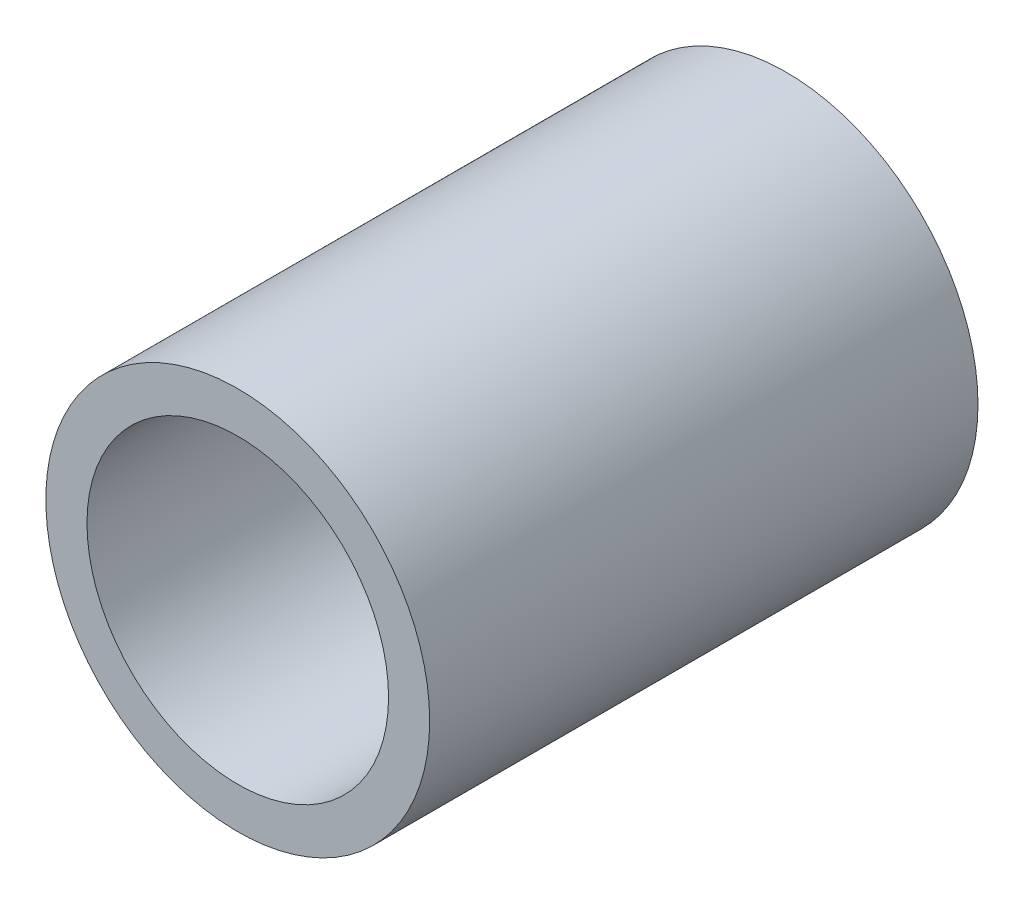
ISO-10303-21;
HEADER;
FILE_DESCRIPTION(('STEP AP214'),'2;1');
FILE_NAME('part.step','',(''),(''),'','','');
FILE_SCHEMA(('AUTOMOTIVE_DESIGN { 1 0 10303 214 1 1 1 1 }'));
ENDSEC;
DATA;
#1=APPLICATION_CONTEXT('core data for automotive mechanical design processes');
#2=APPLICATION_PROTOCOL_DEFINITION('international standard','automotive_design',2000,#1);
#3=PRODUCT_CONTEXT('',#1,'mechanical');
#4=PRODUCT('Part','Part','',(#3));
#5=PRODUCT_RELATED_PRODUCT_CATEGORY('part','',(#4));
#6=PRODUCT_DEFINITION_FORMATION('','',#4);
#7=PRODUCT_DEFINITION_CONTEXT('part definition',#1,'design');
#8=PRODUCT_DEFINITION('design','',#6,#7);
#9=PRODUCT_DEFINITION_SHAPE('','',#8);
#10=(LENGTH_UNIT() NAMED_UNIT(*) SI_UNIT(.MILLI.,.METRE.));
#11=(NAMED_UNIT(*) PLANE_ANGLE_UNIT() SI_UNIT($,.RADIAN.));
#12=(NAMED_UNIT(*) SI_UNIT($,.STERADIAN.) SOLID_ANGLE_UNIT());
#13=UNCERTAINTY_MEASURE_WITH_UNIT(LENGTH_MEASURE(1.E-05),#10,'distance_accuracy_value','');
#14=(GEOMETRIC_REPRESENTATION_CONTEXT(3) GLOBAL_UNCERTAINTY_ASSIGNED_CONTEXT((#13)) GLOBAL_UNIT_ASSIGNED_CONTEXT((#10,
#11,#12)) REPRESENTATION_CONTEXT('',''));
#15=CARTESIAN_POINT('',(0.,0.,0.));
#16=DIRECTION('',(0.,0.,1.));
#17=DIRECTION('',(1.,0.,0.));
#18=AXIS2_PLACEMENT_3D('',#15,#16,#17);
#19=CARTESIAN_POINT('',(234.294911567853,5.27968752307434,16.9643396554945));
#20=DIRECTION('',(0.,0.,1.));
#21=DIRECTION('',(1.,0.,0.));
#22=AXIS2_PLACEMENT_3D('',#19,#20,#21);
#23=PLANE('',#22);
#24=CARTESIAN_POINT('',(234.294911567853,5.27968752307434,16.9643396554945));
#25=DIRECTION('',(0.,0.,1.));
#26=DIRECTION('',(1.,0.,0.));
#27=AXIS2_PLACEMENT_3D('',#24,#25,#26);
#28=CIRCLE('',#27,3.50000000000002);
#29=CARTESIAN_POINT('',(237.794911567853,5.27968752307434,16.9643396554945));
#30=VERTEX_POINT('',#29);
#31=EDGE_CURVE('E50',#30,#30,#28,.T.);
#32=ORIENTED_EDGE('',*,*,#31,.T.);
#33=EDGE_LOOP('',(#32));
#34=FACE_BOUND('',#33,.T.);
#35=CARTESIAN_POINT('',(234.294911567853,5.27968752307434,16.9643396554945));
#36=DIRECTION('',(0.,0.,1.));
#37=DIRECTION('',(1.,0.,0.));
#38=AXIS2_PLACEMENT_3D('',#35,#36,#37);
#39=CIRCLE('',#38,2.75000000000004);
#40=CARTESIAN_POINT('',(237.044911567853,5.27968752307434,16.9643396554945));
#41=VERTEX_POINT('',#40);
#42=EDGE_CURVE('E59',#41,#41,#39,.T.);
#43=ORIENTED_EDGE('',*,*,#42,.F.);
#44=EDGE_LOOP('',(#43));
#45=FACE_BOUND('',#44,.T.);
#46=ADVANCED_FACE('F43',(#34,#45),#23,.T.);
#47=CARTESIAN_POINT('',(234.294911567853,5.27968752307434,6.9643396554945));
#48=DIRECTION('',(0.,0.,1.));
#49=DIRECTION('',(1.,0.,0.));
#50=AXIS2_PLACEMENT_3D('',#47,#48,#49);
#51=PLANE('',#50);
#52=CARTESIAN_POINT('',(234.294911567853,5.27968752307434,6.9643396554945));
#53=DIRECTION('',(0.,0.,1.));
#54=DIRECTION('',(1.,0.,0.));
#55=AXIS2_PLACEMENT_3D('',#52,#53,#54);
#56=CIRCLE('',#55,3.50000000000002);
#57=CARTESIAN_POINT('',(237.794911567853,5.27968752307434,6.9643396554945));
#58=VERTEX_POINT('',#57);
#59=EDGE_CURVE('E54',#58,#58,#56,.T.);
#60=ORIENTED_EDGE('',*,*,#59,.F.);
#61=EDGE_LOOP('',(#60));
#62=FACE_BOUND('',#61,.T.);
#63=CARTESIAN_POINT('',(234.294911567853,5.27968752307434,6.9643396554945));
#64=DIRECTION('',(0.,0.,1.));
#65=DIRECTION('',(1.,0.,0.));
#66=AXIS2_PLACEMENT_3D('',#63,#64,#65);
#67=CIRCLE('',#66,1.80000000000001);
#68=CARTESIAN_POINT('',(236.094911567853,5.27968752307434,6.9643396554945));
#69=VERTEX_POINT('',#68);
#70=EDGE_CURVE('E64',#69,#69,#67,.T.);
#71=ORIENTED_EDGE('',*,*,#70,.T.);
#72=EDGE_LOOP('',(#71));
#73=FACE_BOUND('',#72,.T.);
#74=ADVANCED_FACE('F82',(#62,#73),#51,.F.);
#75=CARTESIAN_POINT('',(234.294911567853,5.27968752307434,16.9643396554945));
#76=DIRECTION('',(0.,0.,-1.));
#77=DIRECTION('',(-1.,0.,0.));
#78=AXIS2_PLACEMENT_3D('',#75,#76,#77);
#79=CYLINDRICAL_SURFACE('',#78,3.50000000000002);
#80=ORIENTED_EDGE('',*,*,#31,.F.);
#81=EDGE_LOOP('',(#80));
#82=FACE_BOUND('',#81,.T.);
#83=ORIENTED_EDGE('',*,*,#59,.T.);
#84=EDGE_LOOP('',(#83));
#85=FACE_BOUND('',#84,.T.);
#86=ADVANCED_FACE('F45',(#82,#85),#79,.T.);
#87=CARTESIAN_POINT('',(234.294911567853,5.27968752307434,16.9643396554945));
#88=DIRECTION('',(0.,0.,-1.));
#89=DIRECTION('',(-1.,0.,0.));
#90=AXIS2_PLACEMENT_3D('',#87,#88,#89);
#91=CYLINDRICAL_SURFACE('',#90,2.75000000000004);
#92=CARTESIAN_POINT('',(234.294911567853,5.27968752307434,9.9643396554945));
#93=DIRECTION('',(0.,0.,1.));
#94=DIRECTION('',(1.,0.,0.));
#95=AXIS2_PLACEMENT_3D('',#92,#93,#94);
#96=CIRCLE('',#95,2.75000000000004);
#97=CARTESIAN_POINT('',(237.044911567853,5.27968752307434,9.9643396554945));
#98=VERTEX_POINT('',#97);
#99=EDGE_CURVE('E11',#98,#98,#96,.T.);
#100=ORIENTED_EDGE('',*,*,#99,.F.);
#101=EDGE_LOOP('',(#100));
#102=FACE_BOUND('',#101,.T.);
#103=ORIENTED_EDGE('',*,*,#42,.T.);
#104=EDGE_LOOP('',(#103));
#105=FACE_BOUND('',#104,.T.);
#106=ADVANCED_FACE('F79',(#102,#105),#91,.F.);
#107=CARTESIAN_POINT('',(234.294911567853,5.27968752307434,9.9643396554945));
#108=DIRECTION('',(0.,0.,-1.));
#109=DIRECTION('',(-1.,0.,0.));
#110=AXIS2_PLACEMENT_3D('',#107,#108,#109);
#111=CYLINDRICAL_SURFACE('',#110,1.80000000000001);
#112=CARTESIAN_POINT('',(234.294911567853,5.27968752307434,9.9643396554945));
#113=DIRECTION('',(0.,0.,1.));
#114=DIRECTION('',(1.,0.,0.));
#115=AXIS2_PLACEMENT_3D('',#112,#113,#114);
#116=CIRCLE('',#115,1.80000000000001);
#117=CARTESIAN_POINT('',(236.094911567853,5.27968752307434,9.9643396554945));
#118=VERTEX_POINT('',#117);
#119=EDGE_CURVE('E63',#118,#118,#116,.T.);
#120=ORIENTED_EDGE('',*,*,#119,.T.);
#121=EDGE_LOOP('',(#120));
#122=FACE_BOUND('',#121,.T.);
#123=ORIENTED_EDGE('',*,*,#70,.F.);
#124=EDGE_LOOP('',(#123));
#125=FACE_BOUND('',#124,.T.);
#126=ADVANCED_FACE('F70',(#122,#125),#111,.F.);
#127=CARTESIAN_POINT('',(0.,0.,9.9643396554945));
#128=DIRECTION('',(0.,0.,1.));
#129=DIRECTION('',(1.,0.,0.));
#130=AXIS2_PLACEMENT_3D('',#127,#128,#129);
#131=PLANE('',#130);
#132=ORIENTED_EDGE('',*,*,#99,.T.);
#133=EDGE_LOOP('',(#132));
#134=FACE_BOUND('',#133,.T.);
#135=ORIENTED_EDGE('',*,*,#119,.F.);
#136=EDGE_LOOP('',(#135));
#137=FACE_BOUND('',#136,.T.);
#138=ADVANCED_FACE('F73',(#134,#137),#131,.T.);
#139=CLOSED_SHELL('',(#46,#74,#86,#106,#126,#138));
#140=MANIFOLD_SOLID_BREP('B2',#139);
#141=ADVANCED_BREP_SHAPE_REPRESENTATION('',(#18,#140),#14);
#142=SHAPE_DEFINITION_REPRESENTATION(#9,#141);
ENDSEC;
END-ISO-10303-21;
